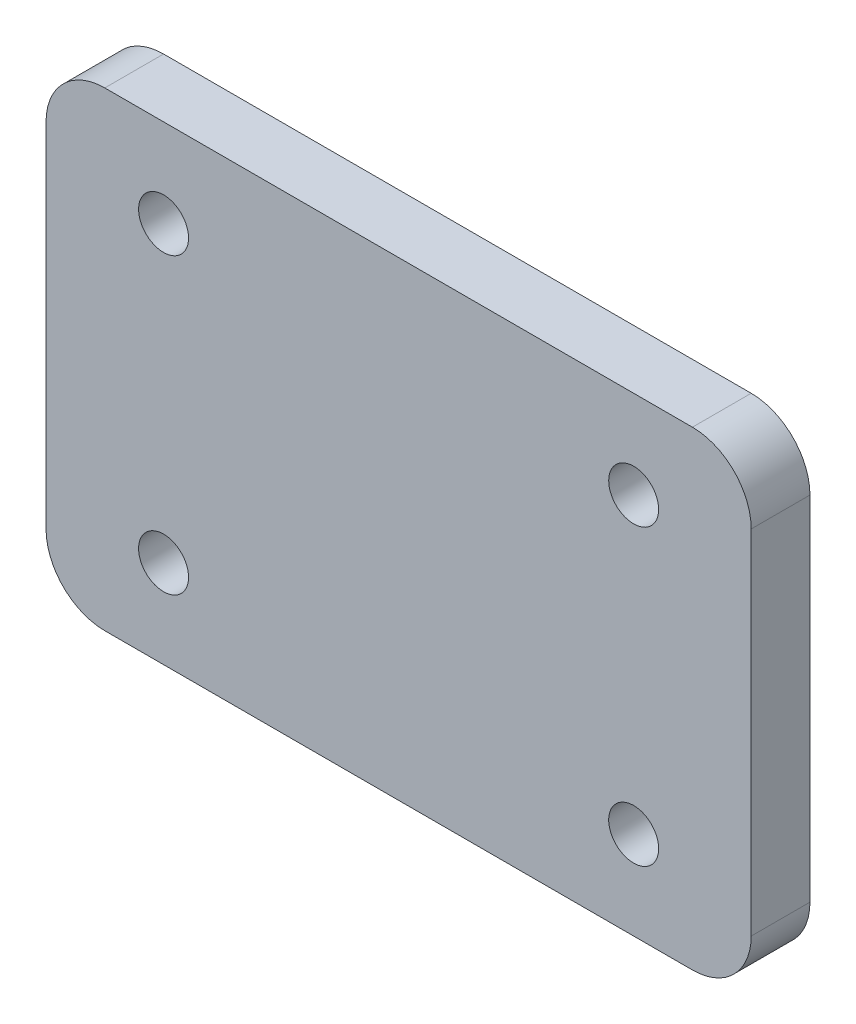
ISO-10303-21;
HEADER;
FILE_DESCRIPTION(('STEP AP214'),'2;1');
FILE_NAME('part.step','',(''),(''),'','','');
FILE_SCHEMA(('AUTOMOTIVE_DESIGN { 1 0 10303 214 1 1 1 1 }'));
ENDSEC;
DATA;
#1=APPLICATION_CONTEXT('core data for automotive mechanical design processes');
#2=APPLICATION_PROTOCOL_DEFINITION('international standard','automotive_design',2000,#1);
#3=PRODUCT_CONTEXT('',#1,'mechanical');
#4=PRODUCT('Part','Part','',(#3));
#5=PRODUCT_RELATED_PRODUCT_CATEGORY('part','',(#4));
#6=PRODUCT_DEFINITION_FORMATION('','',#4);
#7=PRODUCT_DEFINITION_CONTEXT('part definition',#1,'design');
#8=PRODUCT_DEFINITION('design','',#6,#7);
#9=PRODUCT_DEFINITION_SHAPE('','',#8);
#10=(LENGTH_UNIT() NAMED_UNIT(*) SI_UNIT(.MILLI.,.METRE.));
#11=(NAMED_UNIT(*) PLANE_ANGLE_UNIT() SI_UNIT($,.RADIAN.));
#12=(NAMED_UNIT(*) SI_UNIT($,.STERADIAN.) SOLID_ANGLE_UNIT());
#13=UNCERTAINTY_MEASURE_WITH_UNIT(LENGTH_MEASURE(1.E-05),#10,'distance_accuracy_value','');
#14=(GEOMETRIC_REPRESENTATION_CONTEXT(3) GLOBAL_UNCERTAINTY_ASSIGNED_CONTEXT((#13)) GLOBAL_UNIT_ASSIGNED_CONTEXT((#10,
#11,#12)) REPRESENTATION_CONTEXT('',''));
#15=CARTESIAN_POINT('',(0.,0.,0.));
#16=DIRECTION('',(0.,0.,1.));
#17=DIRECTION('',(1.,0.,0.));
#18=AXIS2_PLACEMENT_3D('',#15,#16,#17);
#19=CARTESIAN_POINT('',(60.,40.,-10.));
#20=DIRECTION('',(1.,0.,0.));
#21=DIRECTION('',(0.,1.,0.));
#22=AXIS2_PLACEMENT_3D('',#19,#20,#21);
#23=PLANE('',#22);
#24=DIRECTION('',(0.,1.,0.));
#25=VECTOR('',#24,1.);
#26=CARTESIAN_POINT('',(60.,40.,-10.));
#27=LINE('',#26,#25);
#28=CARTESIAN_POINT('',(60.,-30.,-10.));
#29=VERTEX_POINT('',#28);
#30=CARTESIAN_POINT('',(60.,30.,-10.));
#31=VERTEX_POINT('',#30);
#32=EDGE_CURVE('E176',#29,#31,#27,.T.);
#33=ORIENTED_EDGE('',*,*,#32,.T.);
#34=DIRECTION('',(0.,0.,1.));
#35=VECTOR('',#34,1.);
#36=CARTESIAN_POINT('',(60.,30.,-10.));
#37=LINE('',#36,#35);
#38=CARTESIAN_POINT('',(60.,30.,0.));
#39=VERTEX_POINT('',#38);
#40=EDGE_CURVE('E130',#31,#39,#37,.T.);
#41=ORIENTED_EDGE('',*,*,#40,.T.);
#42=DIRECTION('',(0.,1.,0.));
#43=VECTOR('',#42,1.);
#44=CARTESIAN_POINT('',(60.,40.,0.));
#45=LINE('',#44,#43);
#46=CARTESIAN_POINT('',(60.,-30.,0.));
#47=VERTEX_POINT('',#46);
#48=EDGE_CURVE('E114',#47,#39,#45,.T.);
#49=ORIENTED_EDGE('',*,*,#48,.F.);
#50=DIRECTION('',(0.,0.,1.));
#51=VECTOR('',#50,1.);
#52=CARTESIAN_POINT('',(60.,-30.,-10.));
#53=LINE('',#52,#51);
#54=EDGE_CURVE('E127',#47,#29,#53,.F.);
#55=ORIENTED_EDGE('',*,*,#54,.T.);
#56=EDGE_LOOP('',(#33,#41,#49,#55));
#57=FACE_BOUND('',#56,.T.);
#58=ADVANCED_FACE('F45',(#57),#23,.T.);
#59=CARTESIAN_POINT('',(-60.,-40.,-10.));
#60=DIRECTION('',(0.,-1.,0.));
#61=DIRECTION('',(0.,0.,-1.));
#62=AXIS2_PLACEMENT_3D('',#59,#60,#61);
#63=PLANE('',#62);
#64=DIRECTION('',(1.,0.,0.));
#65=VECTOR('',#64,1.);
#66=CARTESIAN_POINT('',(-60.,-40.,-10.));
#67=LINE('',#66,#65);
#68=CARTESIAN_POINT('',(-50.,-40.,-10.));
#69=VERTEX_POINT('',#68);
#70=CARTESIAN_POINT('',(50.,-40.,-10.));
#71=VERTEX_POINT('',#70);
#72=EDGE_CURVE('E137',#69,#71,#67,.T.);
#73=ORIENTED_EDGE('',*,*,#72,.T.);
#74=DIRECTION('',(0.,0.,1.));
#75=VECTOR('',#74,1.);
#76=CARTESIAN_POINT('',(50.,-40.,-10.));
#77=LINE('',#76,#75);
#78=CARTESIAN_POINT('',(50.,-40.,0.));
#79=VERTEX_POINT('',#78);
#80=EDGE_CURVE('E163',#71,#79,#77,.T.);
#81=ORIENTED_EDGE('',*,*,#80,.T.);
#82=DIRECTION('',(1.,0.,0.));
#83=VECTOR('',#82,1.);
#84=CARTESIAN_POINT('',(-60.,-40.,0.));
#85=LINE('',#84,#83);
#86=CARTESIAN_POINT('',(-50.,-40.,0.));
#87=VERTEX_POINT('',#86);
#88=EDGE_CURVE('E116',#87,#79,#85,.T.);
#89=ORIENTED_EDGE('',*,*,#88,.F.);
#90=DIRECTION('',(0.,0.,1.));
#91=VECTOR('',#90,1.);
#92=CARTESIAN_POINT('',(-50.,-40.,-10.));
#93=LINE('',#92,#91);
#94=EDGE_CURVE('E161',#87,#69,#93,.F.);
#95=ORIENTED_EDGE('',*,*,#94,.T.);
#96=EDGE_LOOP('',(#73,#81,#89,#95));
#97=FACE_BOUND('',#96,.T.);
#98=ADVANCED_FACE('F165',(#97),#63,.T.);
#99=CARTESIAN_POINT('',(-60.,40.,-10.));
#100=DIRECTION('',(-1.,0.,0.));
#101=DIRECTION('',(0.,-1.,0.));
#102=AXIS2_PLACEMENT_3D('',#99,#100,#101);
#103=PLANE('',#102);
#104=DIRECTION('',(0.,-1.,0.));
#105=VECTOR('',#104,1.);
#106=CARTESIAN_POINT('',(-60.,40.,-10.));
#107=LINE('',#106,#105);
#108=CARTESIAN_POINT('',(-60.,30.,-10.));
#109=VERTEX_POINT('',#108);
#110=CARTESIAN_POINT('',(-60.,-30.,-10.));
#111=VERTEX_POINT('',#110);
#112=EDGE_CURVE('E142',#109,#111,#107,.T.);
#113=ORIENTED_EDGE('',*,*,#112,.T.);
#114=DIRECTION('',(0.,0.,1.));
#115=VECTOR('',#114,1.);
#116=CARTESIAN_POINT('',(-60.,-30.,-10.));
#117=LINE('',#116,#115);
#118=CARTESIAN_POINT('',(-60.,-30.,0.));
#119=VERTEX_POINT('',#118);
#120=EDGE_CURVE('E11',#111,#119,#117,.T.);
#121=ORIENTED_EDGE('',*,*,#120,.T.);
#122=DIRECTION('',(0.,-1.,0.));
#123=VECTOR('',#122,1.);
#124=CARTESIAN_POINT('',(-60.,40.,0.));
#125=LINE('',#124,#123);
#126=CARTESIAN_POINT('',(-60.,30.,0.));
#127=VERTEX_POINT('',#126);
#128=EDGE_CURVE('E174',#127,#119,#125,.T.);
#129=ORIENTED_EDGE('',*,*,#128,.F.);
#130=DIRECTION('',(0.,0.,1.));
#131=VECTOR('',#130,1.);
#132=CARTESIAN_POINT('',(-60.,30.,-10.));
#133=LINE('',#132,#131);
#134=EDGE_CURVE('E53',#127,#109,#133,.F.);
#135=ORIENTED_EDGE('',*,*,#134,.T.);
#136=EDGE_LOOP('',(#113,#121,#129,#135));
#137=FACE_BOUND('',#136,.T.);
#138=ADVANCED_FACE('F173',(#137),#103,.T.);
#139=CARTESIAN_POINT('',(-60.,40.,-10.));
#140=DIRECTION('',(0.,1.,0.));
#141=DIRECTION('',(0.,0.,1.));
#142=AXIS2_PLACEMENT_3D('',#139,#140,#141);
#143=PLANE('',#142);
#144=DIRECTION('',(-1.,0.,0.));
#145=VECTOR('',#144,1.);
#146=CARTESIAN_POINT('',(-60.,40.,0.));
#147=LINE('',#146,#145);
#148=CARTESIAN_POINT('',(50.,40.,0.));
#149=VERTEX_POINT('',#148);
#150=CARTESIAN_POINT('',(-50.,40.,0.));
#151=VERTEX_POINT('',#150);
#152=EDGE_CURVE('E131',#149,#151,#147,.T.);
#153=ORIENTED_EDGE('',*,*,#152,.F.);
#154=DIRECTION('',(0.,0.,1.));
#155=VECTOR('',#154,1.);
#156=CARTESIAN_POINT('',(50.,40.,-10.));
#157=LINE('',#156,#155);
#158=CARTESIAN_POINT('',(50.,40.,-10.));
#159=VERTEX_POINT('',#158);
#160=EDGE_CURVE('E153',#149,#159,#157,.F.);
#161=ORIENTED_EDGE('',*,*,#160,.T.);
#162=DIRECTION('',(-1.,0.,0.));
#163=VECTOR('',#162,1.);
#164=CARTESIAN_POINT('',(-60.,40.,-10.));
#165=LINE('',#164,#163);
#166=CARTESIAN_POINT('',(-50.,40.,-10.));
#167=VERTEX_POINT('',#166);
#168=EDGE_CURVE('E180',#159,#167,#165,.T.);
#169=ORIENTED_EDGE('',*,*,#168,.T.);
#170=DIRECTION('',(0.,0.,1.));
#171=VECTOR('',#170,1.);
#172=CARTESIAN_POINT('',(-50.,40.,-10.));
#173=LINE('',#172,#171);
#174=EDGE_CURVE('E150',#167,#151,#173,.T.);
#175=ORIENTED_EDGE('',*,*,#174,.T.);
#176=EDGE_LOOP('',(#153,#161,#169,#175));
#177=FACE_BOUND('',#176,.T.);
#178=ADVANCED_FACE('F224',(#177),#143,.T.);
#179=CARTESIAN_POINT('',(0.,0.,-10.));
#180=DIRECTION('',(0.,0.,1.));
#181=DIRECTION('',(1.,0.,0.));
#182=AXIS2_PLACEMENT_3D('',#179,#180,#181);
#183=PLANE('',#182);
#184=CARTESIAN_POINT('',(-40.,-25.,-10.));
#185=DIRECTION('',(0.,0.,1.));
#186=DIRECTION('',(1.,0.,0.));
#187=AXIS2_PLACEMENT_3D('',#184,#185,#186);
#188=CIRCLE('',#187,4.25);
#189=CARTESIAN_POINT('',(-35.75,-25.,-10.));
#190=VERTEX_POINT('',#189);
#191=EDGE_CURVE('E132',#190,#190,#188,.T.);
#192=ORIENTED_EDGE('',*,*,#191,.T.);
#193=EDGE_LOOP('',(#192));
#194=FACE_BOUND('',#193,.T.);
#195=CARTESIAN_POINT('',(40.,-25.,-10.));
#196=DIRECTION('',(0.,0.,1.));
#197=DIRECTION('',(1.,0.,0.));
#198=AXIS2_PLACEMENT_3D('',#195,#196,#197);
#199=CIRCLE('',#198,4.25);
#200=CARTESIAN_POINT('',(44.25,-25.,-10.));
#201=VERTEX_POINT('',#200);
#202=EDGE_CURVE('E186',#201,#201,#199,.T.);
#203=ORIENTED_EDGE('',*,*,#202,.T.);
#204=EDGE_LOOP('',(#203));
#205=FACE_BOUND('',#204,.T.);
#206=CARTESIAN_POINT('',(40.,25.,-10.));
#207=DIRECTION('',(0.,0.,1.));
#208=DIRECTION('',(1.,0.,0.));
#209=AXIS2_PLACEMENT_3D('',#206,#207,#208);
#210=CIRCLE('',#209,4.25);
#211=CARTESIAN_POINT('',(44.25,25.,-10.));
#212=VERTEX_POINT('',#211);
#213=EDGE_CURVE('E189',#212,#212,#210,.T.);
#214=ORIENTED_EDGE('',*,*,#213,.T.);
#215=EDGE_LOOP('',(#214));
#216=FACE_BOUND('',#215,.T.);
#217=CARTESIAN_POINT('',(-40.,25.,-10.));
#218=DIRECTION('',(0.,0.,1.));
#219=DIRECTION('',(1.,0.,0.));
#220=AXIS2_PLACEMENT_3D('',#217,#218,#219);
#221=CIRCLE('',#220,4.25);
#222=CARTESIAN_POINT('',(-35.75,25.,-10.));
#223=VERTEX_POINT('',#222);
#224=EDGE_CURVE('E192',#223,#223,#221,.T.);
#225=ORIENTED_EDGE('',*,*,#224,.T.);
#226=EDGE_LOOP('',(#225));
#227=FACE_BOUND('',#226,.T.);
#228=ORIENTED_EDGE('',*,*,#168,.F.);
#229=CARTESIAN_POINT('',(50.,30.,-10.));
#230=DIRECTION('',(0.,0.,1.));
#231=DIRECTION('',(1.,0.,0.));
#232=AXIS2_PLACEMENT_3D('',#229,#230,#231);
#233=CIRCLE('',#232,10.);
#234=EDGE_CURVE('E159',#159,#31,#233,.F.);
#235=ORIENTED_EDGE('',*,*,#234,.T.);
#236=ORIENTED_EDGE('',*,*,#32,.F.);
#237=CARTESIAN_POINT('',(50.,-30.,-10.));
#238=DIRECTION('',(0.,0.,1.));
#239=DIRECTION('',(1.,0.,0.));
#240=AXIS2_PLACEMENT_3D('',#237,#238,#239);
#241=CIRCLE('',#240,10.);
#242=EDGE_CURVE('E136',#29,#71,#241,.F.);
#243=ORIENTED_EDGE('',*,*,#242,.T.);
#244=ORIENTED_EDGE('',*,*,#72,.F.);
#245=CARTESIAN_POINT('',(-50.,-30.,-10.));
#246=DIRECTION('',(0.,0.,1.));
#247=DIRECTION('',(1.,0.,0.));
#248=AXIS2_PLACEMENT_3D('',#245,#246,#247);
#249=CIRCLE('',#248,10.);
#250=EDGE_CURVE('E60',#69,#111,#249,.F.);
#251=ORIENTED_EDGE('',*,*,#250,.T.);
#252=ORIENTED_EDGE('',*,*,#112,.F.);
#253=CARTESIAN_POINT('',(-50.,30.,-10.));
#254=DIRECTION('',(0.,0.,1.));
#255=DIRECTION('',(1.,0.,0.));
#256=AXIS2_PLACEMENT_3D('',#253,#254,#255);
#257=CIRCLE('',#256,10.);
#258=EDGE_CURVE('E155',#109,#167,#257,.F.);
#259=ORIENTED_EDGE('',*,*,#258,.T.);
#260=EDGE_LOOP('',(#228,#235,#236,#243,#244,#251,#252,#259));
#261=FACE_BOUND('',#260,.T.);
#262=ADVANCED_FACE('F168',(#194,#205,#216,#227,#261),#183,.F.);
#263=CARTESIAN_POINT('',(0.,0.,0.));
#264=DIRECTION('',(0.,0.,1.));
#265=DIRECTION('',(1.,0.,0.));
#266=AXIS2_PLACEMENT_3D('',#263,#264,#265);
#267=PLANE('',#266);
#268=CARTESIAN_POINT('',(-40.,-25.,0.));
#269=DIRECTION('',(0.,0.,1.));
#270=DIRECTION('',(-1.,0.,0.));
#271=AXIS2_PLACEMENT_3D('',#268,#269,#270);
#272=CIRCLE('',#271,4.25);
#273=CARTESIAN_POINT('',(-44.25,-25.,0.));
#274=VERTEX_POINT('',#273);
#275=EDGE_CURVE('E199',#274,#274,#272,.T.);
#276=ORIENTED_EDGE('',*,*,#275,.F.);
#277=EDGE_LOOP('',(#276));
#278=FACE_BOUND('',#277,.T.);
#279=CARTESIAN_POINT('',(40.,-25.,0.));
#280=DIRECTION('',(0.,0.,1.));
#281=DIRECTION('',(1.,0.,0.));
#282=AXIS2_PLACEMENT_3D('',#279,#280,#281);
#283=CIRCLE('',#282,4.25);
#284=CARTESIAN_POINT('',(44.25,-25.,0.));
#285=VERTEX_POINT('',#284);
#286=EDGE_CURVE('E202',#285,#285,#283,.T.);
#287=ORIENTED_EDGE('',*,*,#286,.F.);
#288=EDGE_LOOP('',(#287));
#289=FACE_BOUND('',#288,.T.);
#290=CARTESIAN_POINT('',(40.,25.,0.));
#291=DIRECTION('',(0.,0.,1.));
#292=DIRECTION('',(-1.,0.,0.));
#293=AXIS2_PLACEMENT_3D('',#290,#291,#292);
#294=CIRCLE('',#293,4.25);
#295=CARTESIAN_POINT('',(35.75,25.,0.));
#296=VERTEX_POINT('',#295);
#297=EDGE_CURVE('E198',#296,#296,#294,.T.);
#298=ORIENTED_EDGE('',*,*,#297,.F.);
#299=EDGE_LOOP('',(#298));
#300=FACE_BOUND('',#299,.T.);
#301=CARTESIAN_POINT('',(-40.,25.,0.));
#302=DIRECTION('',(0.,0.,1.));
#303=DIRECTION('',(1.,0.,0.));
#304=AXIS2_PLACEMENT_3D('',#301,#302,#303);
#305=CIRCLE('',#304,4.25);
#306=CARTESIAN_POINT('',(-35.75,25.,0.));
#307=VERTEX_POINT('',#306);
#308=EDGE_CURVE('E195',#307,#307,#305,.T.);
#309=ORIENTED_EDGE('',*,*,#308,.F.);
#310=EDGE_LOOP('',(#309));
#311=FACE_BOUND('',#310,.T.);
#312=ORIENTED_EDGE('',*,*,#48,.T.);
#313=CARTESIAN_POINT('',(50.,30.,0.));
#314=DIRECTION('',(0.,0.,1.));
#315=DIRECTION('',(1.,0.,0.));
#316=AXIS2_PLACEMENT_3D('',#313,#314,#315);
#317=CIRCLE('',#316,10.);
#318=EDGE_CURVE('E121',#39,#149,#317,.T.);
#319=ORIENTED_EDGE('',*,*,#318,.T.);
#320=ORIENTED_EDGE('',*,*,#152,.T.);
#321=CARTESIAN_POINT('',(-50.,30.,0.));
#322=DIRECTION('',(0.,0.,1.));
#323=DIRECTION('',(1.,0.,0.));
#324=AXIS2_PLACEMENT_3D('',#321,#322,#323);
#325=CIRCLE('',#324,10.);
#326=EDGE_CURVE('E139',#151,#127,#325,.T.);
#327=ORIENTED_EDGE('',*,*,#326,.T.);
#328=ORIENTED_EDGE('',*,*,#128,.T.);
#329=CARTESIAN_POINT('',(-50.,-30.,0.));
#330=DIRECTION('',(0.,0.,1.));
#331=DIRECTION('',(1.,0.,0.));
#332=AXIS2_PLACEMENT_3D('',#329,#330,#331);
#333=CIRCLE('',#332,10.);
#334=EDGE_CURVE('E122',#119,#87,#333,.T.);
#335=ORIENTED_EDGE('',*,*,#334,.T.);
#336=ORIENTED_EDGE('',*,*,#88,.T.);
#337=CARTESIAN_POINT('',(50.,-30.,0.));
#338=DIRECTION('',(0.,0.,1.));
#339=DIRECTION('',(1.,0.,0.));
#340=AXIS2_PLACEMENT_3D('',#337,#338,#339);
#341=CIRCLE('',#340,10.);
#342=EDGE_CURVE('E111',#79,#47,#341,.T.);
#343=ORIENTED_EDGE('',*,*,#342,.T.);
#344=EDGE_LOOP('',(#312,#319,#320,#327,#328,#335,#336,#343));
#345=FACE_BOUND('',#344,.T.);
#346=ADVANCED_FACE('F113',(#278,#289,#300,#311,#345),#267,.T.);
#347=CARTESIAN_POINT('',(-40.,25.,-20.));
#348=DIRECTION('',(0.,0.,1.));
#349=DIRECTION('',(1.,0.,0.));
#350=AXIS2_PLACEMENT_3D('',#347,#348,#349);
#351=CYLINDRICAL_SURFACE('',#350,4.25);
#352=ORIENTED_EDGE('',*,*,#308,.T.);
#353=EDGE_LOOP('',(#352));
#354=FACE_BOUND('',#353,.T.);
#355=ORIENTED_EDGE('',*,*,#224,.F.);
#356=EDGE_LOOP('',(#355));
#357=FACE_BOUND('',#356,.T.);
#358=ADVANCED_FACE('F213',(#354,#357),#351,.F.);
#359=CARTESIAN_POINT('',(40.,25.,-20.));
#360=DIRECTION('',(0.,0.,1.));
#361=DIRECTION('',(1.,0.,0.));
#362=AXIS2_PLACEMENT_3D('',#359,#360,#361);
#363=CYLINDRICAL_SURFACE('',#362,4.25);
#364=ORIENTED_EDGE('',*,*,#297,.T.);
#365=EDGE_LOOP('',(#364));
#366=FACE_BOUND('',#365,.T.);
#367=ORIENTED_EDGE('',*,*,#213,.F.);
#368=EDGE_LOOP('',(#367));
#369=FACE_BOUND('',#368,.T.);
#370=ADVANCED_FACE('F208',(#366,#369),#363,.F.);
#371=CARTESIAN_POINT('',(40.,-25.,-20.));
#372=DIRECTION('',(0.,0.,1.));
#373=DIRECTION('',(1.,0.,0.));
#374=AXIS2_PLACEMENT_3D('',#371,#372,#373);
#375=CYLINDRICAL_SURFACE('',#374,4.25);
#376=ORIENTED_EDGE('',*,*,#286,.T.);
#377=EDGE_LOOP('',(#376));
#378=FACE_BOUND('',#377,.T.);
#379=ORIENTED_EDGE('',*,*,#202,.F.);
#380=EDGE_LOOP('',(#379));
#381=FACE_BOUND('',#380,.T.);
#382=ADVANCED_FACE('F330',(#378,#381),#375,.F.);
#383=CARTESIAN_POINT('',(-40.,-25.,-20.));
#384=DIRECTION('',(0.,0.,1.));
#385=DIRECTION('',(1.,0.,0.));
#386=AXIS2_PLACEMENT_3D('',#383,#384,#385);
#387=CYLINDRICAL_SURFACE('',#386,4.25);
#388=ORIENTED_EDGE('',*,*,#275,.T.);
#389=EDGE_LOOP('',(#388));
#390=FACE_BOUND('',#389,.T.);
#391=ORIENTED_EDGE('',*,*,#191,.F.);
#392=EDGE_LOOP('',(#391));
#393=FACE_BOUND('',#392,.T.);
#394=ADVANCED_FACE('F244',(#390,#393),#387,.F.);
#395=CARTESIAN_POINT('',(50.,30.,-10.));
#396=DIRECTION('',(0.,0.,1.));
#397=DIRECTION('',(1.,0.,0.));
#398=AXIS2_PLACEMENT_3D('',#395,#396,#397);
#399=CYLINDRICAL_SURFACE('',#398,10.);
#400=ORIENTED_EDGE('',*,*,#234,.F.);
#401=ORIENTED_EDGE('',*,*,#160,.F.);
#402=ORIENTED_EDGE('',*,*,#318,.F.);
#403=ORIENTED_EDGE('',*,*,#40,.F.);
#404=EDGE_LOOP('',(#400,#401,#402,#403));
#405=FACE_BOUND('',#404,.T.);
#406=ADVANCED_FACE('F241',(#405),#399,.T.);
#407=CARTESIAN_POINT('',(50.,-30.,-10.));
#408=DIRECTION('',(0.,0.,1.));
#409=DIRECTION('',(1.,0.,0.));
#410=AXIS2_PLACEMENT_3D('',#407,#408,#409);
#411=CYLINDRICAL_SURFACE('',#410,10.);
#412=ORIENTED_EDGE('',*,*,#242,.F.);
#413=ORIENTED_EDGE('',*,*,#54,.F.);
#414=ORIENTED_EDGE('',*,*,#342,.F.);
#415=ORIENTED_EDGE('',*,*,#80,.F.);
#416=EDGE_LOOP('',(#412,#413,#414,#415));
#417=FACE_BOUND('',#416,.T.);
#418=ADVANCED_FACE('F135',(#417),#411,.T.);
#419=CARTESIAN_POINT('',(-50.,-30.,-10.));
#420=DIRECTION('',(0.,0.,1.));
#421=DIRECTION('',(1.,0.,0.));
#422=AXIS2_PLACEMENT_3D('',#419,#420,#421);
#423=CYLINDRICAL_SURFACE('',#422,10.);
#424=ORIENTED_EDGE('',*,*,#250,.F.);
#425=ORIENTED_EDGE('',*,*,#94,.F.);
#426=ORIENTED_EDGE('',*,*,#334,.F.);
#427=ORIENTED_EDGE('',*,*,#120,.F.);
#428=EDGE_LOOP('',(#424,#425,#426,#427));
#429=FACE_BOUND('',#428,.T.);
#430=ADVANCED_FACE('F171',(#429),#423,.T.);
#431=CARTESIAN_POINT('',(-50.,30.,-10.));
#432=DIRECTION('',(0.,0.,1.));
#433=DIRECTION('',(1.,0.,0.));
#434=AXIS2_PLACEMENT_3D('',#431,#432,#433);
#435=CYLINDRICAL_SURFACE('',#434,10.);
#436=ORIENTED_EDGE('',*,*,#258,.F.);
#437=ORIENTED_EDGE('',*,*,#134,.F.);
#438=ORIENTED_EDGE('',*,*,#326,.F.);
#439=ORIENTED_EDGE('',*,*,#174,.F.);
#440=EDGE_LOOP('',(#436,#437,#438,#439));
#441=FACE_BOUND('',#440,.T.);
#442=ADVANCED_FACE('F47',(#441),#435,.T.);
#443=CLOSED_SHELL('',(#58,#98,#138,#178,#262,#346,#358,#370,#382,#394,#406,#418,#430,#442));
#444=MANIFOLD_SOLID_BREP('B2',#443);
#445=ADVANCED_BREP_SHAPE_REPRESENTATION('',(#18,#444),#14);
#446=SHAPE_DEFINITION_REPRESENTATION(#9,#445);
ENDSEC;
END-ISO-10303-21;
